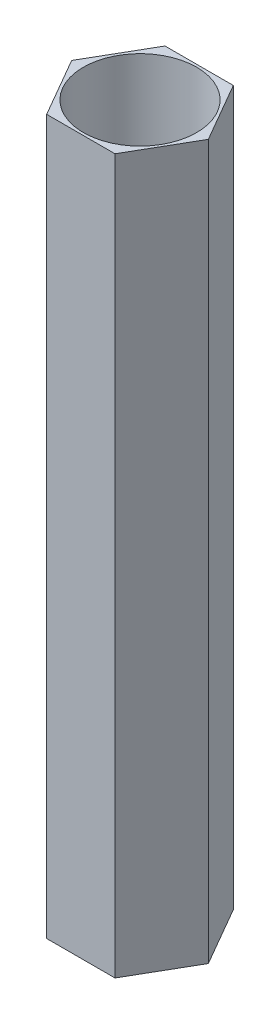
ISO-10303-21;
HEADER;
FILE_DESCRIPTION(('STEP AP214'),'2;1');
FILE_NAME('part.step','',(''),(''),'','','');
FILE_SCHEMA(('AUTOMOTIVE_DESIGN { 1 0 10303 214 1 1 1 1 }'));
ENDSEC;
DATA;
#1=APPLICATION_CONTEXT('core data for automotive mechanical design processes');
#2=APPLICATION_PROTOCOL_DEFINITION('international standard','automotive_design',2000,#1);
#3=PRODUCT_CONTEXT('',#1,'mechanical');
#4=PRODUCT('Part','Part','',(#3));
#5=PRODUCT_RELATED_PRODUCT_CATEGORY('part','',(#4));
#6=PRODUCT_DEFINITION_FORMATION('','',#4);
#7=PRODUCT_DEFINITION_CONTEXT('part definition',#1,'design');
#8=PRODUCT_DEFINITION('design','',#6,#7);
#9=PRODUCT_DEFINITION_SHAPE('','',#8);
#10=(LENGTH_UNIT() NAMED_UNIT(*) SI_UNIT(.MILLI.,.METRE.));
#11=(NAMED_UNIT(*) PLANE_ANGLE_UNIT() SI_UNIT($,.RADIAN.));
#12=(NAMED_UNIT(*) SI_UNIT($,.STERADIAN.) SOLID_ANGLE_UNIT());
#13=UNCERTAINTY_MEASURE_WITH_UNIT(LENGTH_MEASURE(1.E-05),#10,'distance_accuracy_value','');
#14=(GEOMETRIC_REPRESENTATION_CONTEXT(3) GLOBAL_UNCERTAINTY_ASSIGNED_CONTEXT((#13)) GLOBAL_UNIT_ASSIGNED_CONTEXT((#10,
#11,#12)) REPRESENTATION_CONTEXT('',''));
#15=CARTESIAN_POINT('',(0.,0.,0.));
#16=DIRECTION('',(0.,0.,1.));
#17=DIRECTION('',(1.,0.,0.));
#18=AXIS2_PLACEMENT_3D('',#15,#16,#17);
#19=CARTESIAN_POINT('',(0.,28.35,0.));
#20=DIRECTION('',(0.,1.,0.));
#21=DIRECTION('',(0.,0.,1.));
#22=AXIS2_PLACEMENT_3D('',#19,#20,#21);
#23=PLANE('',#22);
#24=DIRECTION('',(1.,0.,0.));
#25=VECTOR('',#24,1.);
#26=CARTESIAN_POINT('',(-1.35677313259562,28.35,2.35));
#27=LINE('',#26,#25);
#28=CARTESIAN_POINT('',(-1.35677313259562,28.35,2.35));
#29=VERTEX_POINT('',#28);
#30=CARTESIAN_POINT('',(1.35677313259562,28.35,2.35));
#31=VERTEX_POINT('',#30);
#32=EDGE_CURVE('E128',#29,#31,#27,.T.);
#33=ORIENTED_EDGE('',*,*,#32,.T.);
#34=DIRECTION('',(0.5,0.,-0.866025403784438));
#35=VECTOR('',#34,1.);
#36=CARTESIAN_POINT('',(1.35677313259562,28.35,2.35));
#37=LINE('',#36,#35);
#38=CARTESIAN_POINT('',(2.71354626519124,28.35,0.));
#39=VERTEX_POINT('',#38);
#40=EDGE_CURVE('E86',#31,#39,#37,.T.);
#41=ORIENTED_EDGE('',*,*,#40,.T.);
#42=DIRECTION('',(-0.5,0.,-0.866025403784438));
#43=VECTOR('',#42,1.);
#44=CARTESIAN_POINT('',(2.71354626519124,28.35,0.));
#45=LINE('',#44,#43);
#46=CARTESIAN_POINT('',(1.35677313259562,28.35,-2.35));
#47=VERTEX_POINT('',#46);
#48=EDGE_CURVE('E99',#39,#47,#45,.T.);
#49=ORIENTED_EDGE('',*,*,#48,.T.);
#50=DIRECTION('',(-1.,0.,0.));
#51=VECTOR('',#50,1.);
#52=CARTESIAN_POINT('',(1.35677313259562,28.35,-2.35));
#53=LINE('',#52,#51);
#54=CARTESIAN_POINT('',(-1.35677313259562,28.35,-2.35));
#55=VERTEX_POINT('',#54);
#56=EDGE_CURVE('E93',#47,#55,#53,.T.);
#57=ORIENTED_EDGE('',*,*,#56,.T.);
#58=DIRECTION('',(-0.5,0.,0.866025403784439));
#59=VECTOR('',#58,1.);
#60=CARTESIAN_POINT('',(-1.35677313259562,28.35,-2.35));
#61=LINE('',#60,#59);
#62=CARTESIAN_POINT('',(-2.71354626519124,28.35,0.));
#63=VERTEX_POINT('',#62);
#64=EDGE_CURVE('E97',#55,#63,#61,.T.);
#65=ORIENTED_EDGE('',*,*,#64,.T.);
#66=DIRECTION('',(0.5,0.,0.866025403784438));
#67=VECTOR('',#66,1.);
#68=CARTESIAN_POINT('',(-2.71354626519124,28.35,0.));
#69=LINE('',#68,#67);
#70=EDGE_CURVE('E49',#63,#29,#69,.T.);
#71=ORIENTED_EDGE('',*,*,#70,.T.);
#72=EDGE_LOOP('',(#33,#41,#49,#57,#65,#71));
#73=FACE_BOUND('',#72,.T.);
#74=CARTESIAN_POINT('',(0.,28.35,0.));
#75=DIRECTION('',(0.,1.,0.));
#76=DIRECTION('',(0.,0.,1.));
#77=AXIS2_PLACEMENT_3D('',#74,#75,#76);
#78=CIRCLE('',#77,2.25);
#79=CARTESIAN_POINT('',(0.,28.35,-2.25));
#80=VERTEX_POINT('',#79);
#81=EDGE_CURVE('E121',#80,#80,#78,.T.);
#82=ORIENTED_EDGE('',*,*,#81,.F.);
#83=EDGE_LOOP('',(#82));
#84=FACE_BOUND('',#83,.T.);
#85=ADVANCED_FACE('F32',(#73,#84),#23,.T.);
#86=CARTESIAN_POINT('',(0.,0.,0.));
#87=DIRECTION('',(0.,1.,0.));
#88=DIRECTION('',(0.,0.,1.));
#89=AXIS2_PLACEMENT_3D('',#86,#87,#88);
#90=PLANE('',#89);
#91=DIRECTION('',(1.,0.,0.));
#92=VECTOR('',#91,1.);
#93=CARTESIAN_POINT('',(-1.35677313259562,0.,2.35));
#94=LINE('',#93,#92);
#95=CARTESIAN_POINT('',(-1.35677313259562,0.,2.35));
#96=VERTEX_POINT('',#95);
#97=CARTESIAN_POINT('',(1.35677313259562,0.,2.35));
#98=VERTEX_POINT('',#97);
#99=EDGE_CURVE('E117',#96,#98,#94,.T.);
#100=ORIENTED_EDGE('',*,*,#99,.F.);
#101=DIRECTION('',(0.5,0.,0.866025403784438));
#102=VECTOR('',#101,1.);
#103=CARTESIAN_POINT('',(-2.71354626519124,0.,0.));
#104=LINE('',#103,#102);
#105=CARTESIAN_POINT('',(-2.71354626519124,0.,0.));
#106=VERTEX_POINT('',#105);
#107=EDGE_CURVE('E78',#106,#96,#104,.T.);
#108=ORIENTED_EDGE('',*,*,#107,.F.);
#109=DIRECTION('',(-0.5,0.,0.866025403784439));
#110=VECTOR('',#109,1.);
#111=CARTESIAN_POINT('',(-1.35677313259562,0.,-2.35));
#112=LINE('',#111,#110);
#113=CARTESIAN_POINT('',(-1.35677313259562,0.,-2.35));
#114=VERTEX_POINT('',#113);
#115=EDGE_CURVE('E72',#114,#106,#112,.T.);
#116=ORIENTED_EDGE('',*,*,#115,.F.);
#117=DIRECTION('',(-1.,0.,0.));
#118=VECTOR('',#117,1.);
#119=CARTESIAN_POINT('',(1.35677313259562,0.,-2.35));
#120=LINE('',#119,#118);
#121=CARTESIAN_POINT('',(1.35677313259562,0.,-2.35));
#122=VERTEX_POINT('',#121);
#123=EDGE_CURVE('E107',#122,#114,#120,.T.);
#124=ORIENTED_EDGE('',*,*,#123,.F.);
#125=DIRECTION('',(-0.5,0.,-0.866025403784438));
#126=VECTOR('',#125,1.);
#127=CARTESIAN_POINT('',(2.71354626519124,0.,0.));
#128=LINE('',#127,#126);
#129=CARTESIAN_POINT('',(2.71354626519124,0.,0.));
#130=VERTEX_POINT('',#129);
#131=EDGE_CURVE('E123',#130,#122,#128,.T.);
#132=ORIENTED_EDGE('',*,*,#131,.F.);
#133=DIRECTION('',(0.5,0.,-0.866025403784438));
#134=VECTOR('',#133,1.);
#135=CARTESIAN_POINT('',(1.35677313259562,0.,2.35));
#136=LINE('',#135,#134);
#137=EDGE_CURVE('E120',#98,#130,#136,.T.);
#138=ORIENTED_EDGE('',*,*,#137,.F.);
#139=EDGE_LOOP('',(#100,#108,#116,#124,#132,#138));
#140=FACE_BOUND('',#139,.T.);
#141=CARTESIAN_POINT('',(0.,0.,0.));
#142=DIRECTION('',(0.,1.,0.));
#143=DIRECTION('',(0.,0.,1.));
#144=AXIS2_PLACEMENT_3D('',#141,#142,#143);
#145=CIRCLE('',#144,2.25);
#146=CARTESIAN_POINT('',(0.,0.,-2.25));
#147=VERTEX_POINT('',#146);
#148=EDGE_CURVE('E221',#147,#147,#145,.T.);
#149=ORIENTED_EDGE('',*,*,#148,.T.);
#150=EDGE_LOOP('',(#149));
#151=FACE_BOUND('',#150,.T.);
#152=ADVANCED_FACE('F137',(#140,#151),#90,.F.);
#153=CARTESIAN_POINT('',(-1.35677313259562,28.35,2.35));
#154=DIRECTION('',(0.,0.,-1.));
#155=DIRECTION('',(-1.,0.,0.));
#156=AXIS2_PLACEMENT_3D('',#153,#154,#155);
#157=PLANE('',#156);
#158=ORIENTED_EDGE('',*,*,#99,.T.);
#159=DIRECTION('',(0.,-1.,0.));
#160=VECTOR('',#159,1.);
#161=CARTESIAN_POINT('',(1.35677313259562,28.35,2.35));
#162=LINE('',#161,#160);
#163=EDGE_CURVE('E11',#31,#98,#162,.T.);
#164=ORIENTED_EDGE('',*,*,#163,.F.);
#165=ORIENTED_EDGE('',*,*,#32,.F.);
#166=DIRECTION('',(0.,-1.,0.));
#167=VECTOR('',#166,1.);
#168=CARTESIAN_POINT('',(-1.35677313259562,28.35,2.35));
#169=LINE('',#168,#167);
#170=EDGE_CURVE('E113',#29,#96,#169,.T.);
#171=ORIENTED_EDGE('',*,*,#170,.T.);
#172=EDGE_LOOP('',(#158,#164,#165,#171));
#173=FACE_BOUND('',#172,.T.);
#174=ADVANCED_FACE('F34',(#173),#157,.F.);
#175=CARTESIAN_POINT('',(1.35677313259562,28.35,2.35));
#176=DIRECTION('',(-0.866025403784438,0.,-0.5));
#177=DIRECTION('',(-0.5,0.,0.866025403784439));
#178=AXIS2_PLACEMENT_3D('',#175,#176,#177);
#179=PLANE('',#178);
#180=ORIENTED_EDGE('',*,*,#137,.T.);
#181=DIRECTION('',(0.,-1.,0.));
#182=VECTOR('',#181,1.);
#183=CARTESIAN_POINT('',(2.71354626519124,28.35,0.));
#184=LINE('',#183,#182);
#185=EDGE_CURVE('E41',#39,#130,#184,.T.);
#186=ORIENTED_EDGE('',*,*,#185,.F.);
#187=ORIENTED_EDGE('',*,*,#40,.F.);
#188=ORIENTED_EDGE('',*,*,#163,.T.);
#189=EDGE_LOOP('',(#180,#186,#187,#188));
#190=FACE_BOUND('',#189,.T.);
#191=ADVANCED_FACE('F162',(#190),#179,.F.);
#192=CARTESIAN_POINT('',(2.71354626519124,28.35,0.));
#193=DIRECTION('',(-0.866025403784438,0.,0.5));
#194=DIRECTION('',(0.5,0.,0.866025403784439));
#195=AXIS2_PLACEMENT_3D('',#192,#193,#194);
#196=PLANE('',#195);
#197=ORIENTED_EDGE('',*,*,#131,.T.);
#198=DIRECTION('',(0.,-1.,0.));
#199=VECTOR('',#198,1.);
#200=CARTESIAN_POINT('',(1.35677313259562,28.35,-2.35));
#201=LINE('',#200,#199);
#202=EDGE_CURVE('E108',#47,#122,#201,.T.);
#203=ORIENTED_EDGE('',*,*,#202,.F.);
#204=ORIENTED_EDGE('',*,*,#48,.F.);
#205=ORIENTED_EDGE('',*,*,#185,.T.);
#206=EDGE_LOOP('',(#197,#203,#204,#205));
#207=FACE_BOUND('',#206,.T.);
#208=ADVANCED_FACE('F134',(#207),#196,.F.);
#209=CARTESIAN_POINT('',(1.35677313259562,28.35,-2.35));
#210=DIRECTION('',(0.,0.,1.));
#211=DIRECTION('',(1.,0.,0.));
#212=AXIS2_PLACEMENT_3D('',#209,#210,#211);
#213=PLANE('',#212);
#214=ORIENTED_EDGE('',*,*,#123,.T.);
#215=DIRECTION('',(0.,-1.,0.));
#216=VECTOR('',#215,1.);
#217=CARTESIAN_POINT('',(-1.35677313259562,28.35,-2.35));
#218=LINE('',#217,#216);
#219=EDGE_CURVE('E104',#55,#114,#218,.T.);
#220=ORIENTED_EDGE('',*,*,#219,.F.);
#221=ORIENTED_EDGE('',*,*,#56,.F.);
#222=ORIENTED_EDGE('',*,*,#202,.T.);
#223=EDGE_LOOP('',(#214,#220,#221,#222));
#224=FACE_BOUND('',#223,.T.);
#225=ADVANCED_FACE('F105',(#224),#213,.F.);
#226=CARTESIAN_POINT('',(-1.35677313259562,28.35,-2.35));
#227=DIRECTION('',(0.866025403784439,0.,0.5));
#228=DIRECTION('',(0.5,0.,-0.866025403784439));
#229=AXIS2_PLACEMENT_3D('',#226,#227,#228);
#230=PLANE('',#229);
#231=ORIENTED_EDGE('',*,*,#115,.T.);
#232=DIRECTION('',(0.,-1.,0.));
#233=VECTOR('',#232,1.);
#234=CARTESIAN_POINT('',(-2.71354626519124,28.35,0.));
#235=LINE('',#234,#233);
#236=EDGE_CURVE('E109',#63,#106,#235,.T.);
#237=ORIENTED_EDGE('',*,*,#236,.F.);
#238=ORIENTED_EDGE('',*,*,#64,.F.);
#239=ORIENTED_EDGE('',*,*,#219,.T.);
#240=EDGE_LOOP('',(#231,#237,#238,#239));
#241=FACE_BOUND('',#240,.T.);
#242=ADVANCED_FACE('F111',(#241),#230,.F.);
#243=CARTESIAN_POINT('',(-2.71354626519124,28.35,0.));
#244=DIRECTION('',(0.866025403784438,0.,-0.5));
#245=DIRECTION('',(-0.5,0.,-0.866025403784439));
#246=AXIS2_PLACEMENT_3D('',#243,#244,#245);
#247=PLANE('',#246);
#248=ORIENTED_EDGE('',*,*,#107,.T.);
#249=ORIENTED_EDGE('',*,*,#170,.F.);
#250=ORIENTED_EDGE('',*,*,#70,.F.);
#251=ORIENTED_EDGE('',*,*,#236,.T.);
#252=EDGE_LOOP('',(#248,#249,#250,#251));
#253=FACE_BOUND('',#252,.T.);
#254=ADVANCED_FACE('F142',(#253),#247,.F.);
#255=CARTESIAN_POINT('',(0.,28.35,0.));
#256=DIRECTION('',(0.,-1.,0.));
#257=DIRECTION('',(0.,0.,-1.));
#258=AXIS2_PLACEMENT_3D('',#255,#256,#257);
#259=CYLINDRICAL_SURFACE('',#258,2.25);
#260=CARTESIAN_POINT('',(0.,28.35,-2.25));
#261=CARTESIAN_POINT('',(0.,28.0546875,-2.25));
#262=CARTESIAN_POINT('',(0.,27.759375,-2.25));
#263=CARTESIAN_POINT('',(0.,27.16875,-2.25));
#264=CARTESIAN_POINT('',(0.,26.8734375,-2.25));
#265=CARTESIAN_POINT('',(0.,26.2828125,-2.25));
#266=CARTESIAN_POINT('',(0.,25.9875,-2.25));
#267=CARTESIAN_POINT('',(0.,25.396875,-2.25));
#268=CARTESIAN_POINT('',(0.,25.1015625,-2.25));
#269=CARTESIAN_POINT('',(0.,24.5109375,-2.25));
#270=CARTESIAN_POINT('',(0.,24.215625,-2.25));
#271=CARTESIAN_POINT('',(0.,23.625,-2.25));
#272=CARTESIAN_POINT('',(0.,23.3296875,-2.25));
#273=CARTESIAN_POINT('',(0.,22.7390625,-2.25));
#274=CARTESIAN_POINT('',(0.,22.44375,-2.25));
#275=CARTESIAN_POINT('',(0.,21.853125,-2.25));
#276=CARTESIAN_POINT('',(0.,21.5578125,-2.25));
#277=CARTESIAN_POINT('',(0.,20.9671875,-2.25));
#278=CARTESIAN_POINT('',(0.,20.671875,-2.25));
#279=CARTESIAN_POINT('',(0.,20.08125,-2.25));
#280=CARTESIAN_POINT('',(0.,19.7859375,-2.25));
#281=CARTESIAN_POINT('',(0.,19.1953125,-2.25));
#282=CARTESIAN_POINT('',(0.,18.9,-2.25));
#283=CARTESIAN_POINT('',(0.,18.309375,-2.25));
#284=CARTESIAN_POINT('',(0.,18.0140625,-2.25));
#285=CARTESIAN_POINT('',(0.,17.4234375,-2.25));
#286=CARTESIAN_POINT('',(0.,17.128125,-2.25));
#287=CARTESIAN_POINT('',(0.,16.5375,-2.25));
#288=CARTESIAN_POINT('',(0.,16.2421875,-2.25));
#289=CARTESIAN_POINT('',(0.,15.6515625,-2.25));
#290=CARTESIAN_POINT('',(0.,15.35625,-2.25));
#291=CARTESIAN_POINT('',(0.,14.765625,-2.25));
#292=CARTESIAN_POINT('',(0.,14.4703125,-2.25));
#293=CARTESIAN_POINT('',(0.,13.8796875,-2.25));
#294=CARTESIAN_POINT('',(0.,13.584375,-2.25));
#295=CARTESIAN_POINT('',(0.,12.99375,-2.25));
#296=CARTESIAN_POINT('',(0.,12.6984375,-2.25));
#297=CARTESIAN_POINT('',(0.,12.1078125,-2.25));
#298=CARTESIAN_POINT('',(0.,11.8125,-2.25));
#299=CARTESIAN_POINT('',(0.,11.221875,-2.25));
#300=CARTESIAN_POINT('',(0.,10.9265625,-2.25));
#301=CARTESIAN_POINT('',(0.,10.3359375,-2.25));
#302=CARTESIAN_POINT('',(0.,10.040625,-2.25));
#303=CARTESIAN_POINT('',(0.,9.45,-2.25));
#304=CARTESIAN_POINT('',(0.,9.1546875,-2.25));
#305=CARTESIAN_POINT('',(0.,8.5640625,-2.25));
#306=CARTESIAN_POINT('',(0.,8.26875,-2.25));
#307=CARTESIAN_POINT('',(0.,7.678125,-2.25));
#308=CARTESIAN_POINT('',(0.,7.3828125,-2.25));
#309=CARTESIAN_POINT('',(0.,6.7921875,-2.25));
#310=CARTESIAN_POINT('',(0.,6.496875,-2.25));
#311=CARTESIAN_POINT('',(0.,5.90625,-2.25));
#312=CARTESIAN_POINT('',(0.,5.6109375,-2.25));
#313=CARTESIAN_POINT('',(0.,5.0203125,-2.25));
#314=CARTESIAN_POINT('',(0.,4.725,-2.25));
#315=CARTESIAN_POINT('',(0.,4.134375,-2.25));
#316=CARTESIAN_POINT('',(0.,3.8390625,-2.25));
#317=CARTESIAN_POINT('',(0.,3.2484375,-2.25));
#318=CARTESIAN_POINT('',(0.,2.953125,-2.25));
#319=CARTESIAN_POINT('',(0.,2.3625,-2.25));
#320=CARTESIAN_POINT('',(0.,2.0671875,-2.25));
#321=CARTESIAN_POINT('',(0.,1.4765625,-2.25));
#322=CARTESIAN_POINT('',(0.,1.18125,-2.25));
#323=CARTESIAN_POINT('',(0.,0.590624999999996,-2.25));
#324=CARTESIAN_POINT('',(0.,0.295312499999996,-2.25));
#325=CARTESIAN_POINT('',(0.,0.,-2.25));
#326=B_SPLINE_CURVE_WITH_KNOTS('',3,(#260,#261,#262,#263,#264,#265,#266,#267,#268,#269,#270,
#271,#272,#273,#274,#275,#276,#277,#278,#279,#280,#281,#282,#283,#284,#285,#286,#287,#288,#289,
#290,#291,#292,#293,#294,#295,#296,#297,#298,#299,#300,#301,#302,#303,#304,#305,#306,#307,#308,
#309,#310,#311,#312,#313,#314,#315,#316,#317,#318,#319,#320,#321,#322,#323,#324,#325),
.UNSPECIFIED.,.F.,.F.,(4,2,2,2,2,2,2,2,2,2,2,2,2,2,2,2,2,2,2,2,2,2,2,2,2,2,2,2,2,2,2,2,4),(0.,
0.885937500000003,1.771875,2.6578125,3.54375,4.4296875,5.315625,6.2015625,7.0875,7.9734375,
8.859375,9.7453125,10.63125,11.5171875,12.403125,13.2890625,14.175,15.0609375,15.946875,
16.8328125,17.71875,18.6046875,19.490625,20.3765625,21.2625,22.1484375,23.034375,23.9203125,
24.80625,25.6921875,26.578125,27.4640625,28.35),.UNSPECIFIED.);
#327=EDGE_CURVE('BSEAM144',#80,#147,#326,.T.);
#328=ORIENTED_EDGE('',*,*,#81,.T.);
#329=ORIENTED_EDGE('',*,*,#148,.F.);
#330=ORIENTED_EDGE('',*,*,#327,.T.);
#331=ORIENTED_EDGE('',*,*,#327,.F.);
#332=EDGE_LOOP('',(#328,#330,#329,#331));
#333=FACE_BOUND('',#332,.T.);
#334=ADVANCED_FACE('F144',(#333),#259,.F.);
#335=CLOSED_SHELL('',(#85,#152,#174,#191,#208,#225,#242,#254,#334));
#336=MANIFOLD_SOLID_BREP('B2',#335);
#337=ADVANCED_BREP_SHAPE_REPRESENTATION('',(#18,#336),#14);
#338=SHAPE_DEFINITION_REPRESENTATION(#9,#337);
ENDSEC;
END-ISO-10303-21;
